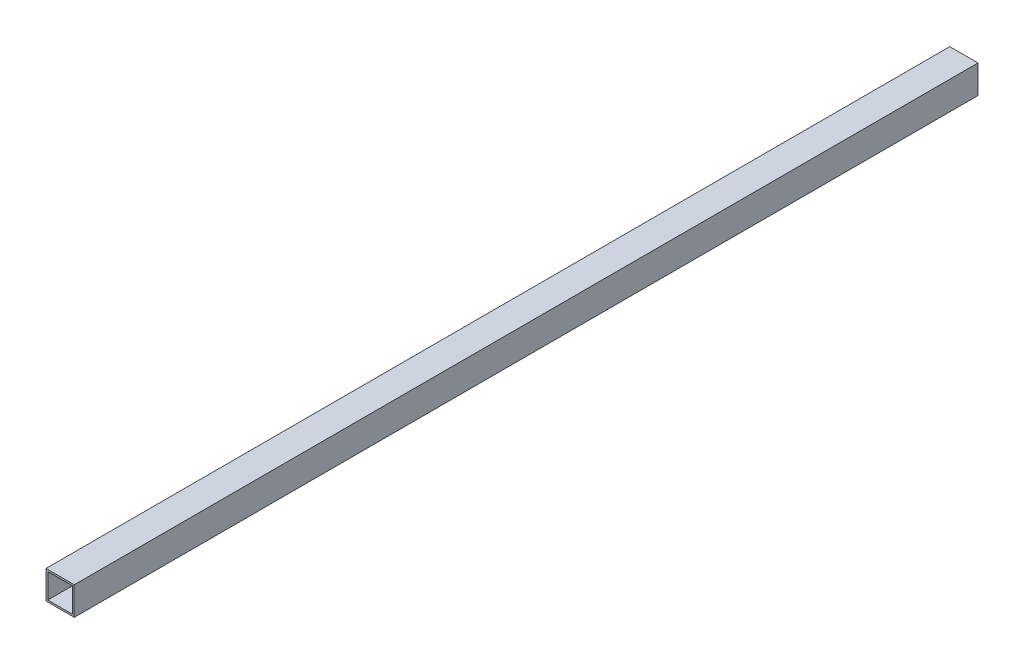
ISO-10303-21;
HEADER;
FILE_DESCRIPTION(('STEP AP214'),'2;1');
FILE_NAME('part.step','',(''),(''),'','','');
FILE_SCHEMA(('AUTOMOTIVE_DESIGN { 1 0 10303 214 1 1 1 1 }'));
ENDSEC;
DATA;
#1=APPLICATION_CONTEXT('core data for automotive mechanical design processes');
#2=APPLICATION_PROTOCOL_DEFINITION('international standard','automotive_design',2000,#1);
#3=PRODUCT_CONTEXT('',#1,'mechanical');
#4=PRODUCT('Part','Part','',(#3));
#5=PRODUCT_RELATED_PRODUCT_CATEGORY('part','',(#4));
#6=PRODUCT_DEFINITION_FORMATION('','',#4);
#7=PRODUCT_DEFINITION_CONTEXT('part definition',#1,'design');
#8=PRODUCT_DEFINITION('design','',#6,#7);
#9=PRODUCT_DEFINITION_SHAPE('','',#8);
#10=(LENGTH_UNIT() NAMED_UNIT(*) SI_UNIT(.MILLI.,.METRE.));
#11=(NAMED_UNIT(*) PLANE_ANGLE_UNIT() SI_UNIT($,.RADIAN.));
#12=(NAMED_UNIT(*) SI_UNIT($,.STERADIAN.) SOLID_ANGLE_UNIT());
#13=UNCERTAINTY_MEASURE_WITH_UNIT(LENGTH_MEASURE(1.E-05),#10,'distance_accuracy_value','');
#14=(GEOMETRIC_REPRESENTATION_CONTEXT(3) GLOBAL_UNCERTAINTY_ASSIGNED_CONTEXT((#13)) GLOBAL_UNIT_ASSIGNED_CONTEXT((#10,
#11,#12)) REPRESENTATION_CONTEXT('',''));
#15=CARTESIAN_POINT('',(0.,0.,0.));
#16=DIRECTION('',(0.,0.,1.));
#17=DIRECTION('',(1.,0.,0.));
#18=AXIS2_PLACEMENT_3D('',#15,#16,#17);
#19=CARTESIAN_POINT('',(0.,0.,1625.6));
#20=DIRECTION('',(0.,0.,-1.));
#21=DIRECTION('',(-1.,0.,0.));
#22=AXIS2_PLACEMENT_3D('',#19,#20,#21);
#23=PLANE('',#22);
#24=DIRECTION('',(0.,1.,0.));
#25=VECTOR('',#24,1.);
#26=CARTESIAN_POINT('',(25.4,-25.4,1625.6));
#27=LINE('',#26,#25);
#28=CARTESIAN_POINT('',(25.4,-25.4,1625.6));
#29=VERTEX_POINT('',#28);
#30=CARTESIAN_POINT('',(25.4,25.4,1625.6));
#31=VERTEX_POINT('',#30);
#32=EDGE_CURVE('E134',#29,#31,#27,.T.);
#33=ORIENTED_EDGE('',*,*,#32,.T.);
#34=DIRECTION('',(-1.,0.,0.));
#35=VECTOR('',#34,1.);
#36=CARTESIAN_POINT('',(-25.4,25.4,1625.6));
#37=LINE('',#36,#35);
#38=CARTESIAN_POINT('',(-25.4,25.4,1625.6));
#39=VERTEX_POINT('',#38);
#40=EDGE_CURVE('E137',#31,#39,#37,.T.);
#41=ORIENTED_EDGE('',*,*,#40,.T.);
#42=DIRECTION('',(0.,-1.,0.));
#43=VECTOR('',#42,1.);
#44=CARTESIAN_POINT('',(-25.4,-25.4,1625.6));
#45=LINE('',#44,#43);
#46=CARTESIAN_POINT('',(-25.4,-25.4,1625.6));
#47=VERTEX_POINT('',#46);
#48=EDGE_CURVE('E140',#39,#47,#45,.T.);
#49=ORIENTED_EDGE('',*,*,#48,.T.);
#50=DIRECTION('',(1.,0.,0.));
#51=VECTOR('',#50,1.);
#52=CARTESIAN_POINT('',(-25.4,-25.4,1625.6));
#53=LINE('',#52,#51);
#54=EDGE_CURVE('E142',#47,#29,#53,.T.);
#55=ORIENTED_EDGE('',*,*,#54,.T.);
#56=EDGE_LOOP('',(#33,#41,#49,#55));
#57=FACE_BOUND('',#56,.T.);
#58=DIRECTION('',(0.,1.,0.));
#59=VECTOR('',#58,1.);
#60=CARTESIAN_POINT('',(22.225,-22.225,1625.6));
#61=LINE('',#60,#59);
#62=CARTESIAN_POINT('',(22.225,-22.225,1625.6));
#63=VERTEX_POINT('',#62);
#64=CARTESIAN_POINT('',(22.225,22.225,1625.6));
#65=VERTEX_POINT('',#64);
#66=EDGE_CURVE('E98',#63,#65,#61,.T.);
#67=ORIENTED_EDGE('',*,*,#66,.F.);
#68=DIRECTION('',(1.,0.,0.));
#69=VECTOR('',#68,1.);
#70=CARTESIAN_POINT('',(-22.225,-22.225,1625.6));
#71=LINE('',#70,#69);
#72=CARTESIAN_POINT('',(-22.225,-22.225,1625.6));
#73=VERTEX_POINT('',#72);
#74=EDGE_CURVE('E120',#73,#63,#71,.T.);
#75=ORIENTED_EDGE('',*,*,#74,.F.);
#76=DIRECTION('',(0.,-1.,0.));
#77=VECTOR('',#76,1.);
#78=CARTESIAN_POINT('',(-22.225,-22.225,1625.6));
#79=LINE('',#78,#77);
#80=CARTESIAN_POINT('',(-22.225,22.225,1625.6));
#81=VERTEX_POINT('',#80);
#82=EDGE_CURVE('E118',#81,#73,#79,.T.);
#83=ORIENTED_EDGE('',*,*,#82,.F.);
#84=DIRECTION('',(-1.,0.,0.));
#85=VECTOR('',#84,1.);
#86=CARTESIAN_POINT('',(-22.225,22.225,1625.6));
#87=LINE('',#86,#85);
#88=EDGE_CURVE('E106',#65,#81,#87,.T.);
#89=ORIENTED_EDGE('',*,*,#88,.F.);
#90=EDGE_LOOP('',(#67,#75,#83,#89));
#91=FACE_BOUND('',#90,.T.);
#92=ADVANCED_FACE('F33',(#57,#91),#23,.F.);
#93=CARTESIAN_POINT('',(0.,0.,0.));
#94=DIRECTION('',(0.,0.,-1.));
#95=DIRECTION('',(-1.,0.,0.));
#96=AXIS2_PLACEMENT_3D('',#93,#94,#95);
#97=PLANE('',#96);
#98=DIRECTION('',(0.,1.,0.));
#99=VECTOR('',#98,1.);
#100=CARTESIAN_POINT('',(25.4,-25.4,0.));
#101=LINE('',#100,#99);
#102=CARTESIAN_POINT('',(25.4,-25.4,0.));
#103=VERTEX_POINT('',#102);
#104=CARTESIAN_POINT('',(25.4,25.4,0.));
#105=VERTEX_POINT('',#104);
#106=EDGE_CURVE('E114',#103,#105,#101,.T.);
#107=ORIENTED_EDGE('',*,*,#106,.F.);
#108=DIRECTION('',(1.,0.,0.));
#109=VECTOR('',#108,1.);
#110=CARTESIAN_POINT('',(-25.4,-25.4,0.));
#111=LINE('',#110,#109);
#112=CARTESIAN_POINT('',(-25.4,-25.4,0.));
#113=VERTEX_POINT('',#112);
#114=EDGE_CURVE('E138',#113,#103,#111,.T.);
#115=ORIENTED_EDGE('',*,*,#114,.F.);
#116=DIRECTION('',(0.,-1.,0.));
#117=VECTOR('',#116,1.);
#118=CARTESIAN_POINT('',(-25.4,-25.4,0.));
#119=LINE('',#118,#117);
#120=CARTESIAN_POINT('',(-25.4,25.4,0.));
#121=VERTEX_POINT('',#120);
#122=EDGE_CURVE('E149',#121,#113,#119,.T.);
#123=ORIENTED_EDGE('',*,*,#122,.F.);
#124=DIRECTION('',(-1.,0.,0.));
#125=VECTOR('',#124,1.);
#126=CARTESIAN_POINT('',(-25.4,25.4,0.));
#127=LINE('',#126,#125);
#128=EDGE_CURVE('E147',#105,#121,#127,.T.);
#129=ORIENTED_EDGE('',*,*,#128,.F.);
#130=EDGE_LOOP('',(#107,#115,#123,#129));
#131=FACE_BOUND('',#130,.T.);
#132=DIRECTION('',(1.,0.,0.));
#133=VECTOR('',#132,1.);
#134=CARTESIAN_POINT('',(-22.225,-22.225,0.));
#135=LINE('',#134,#133);
#136=CARTESIAN_POINT('',(-22.225,-22.225,0.));
#137=VERTEX_POINT('',#136);
#138=CARTESIAN_POINT('',(22.225,-22.225,0.));
#139=VERTEX_POINT('',#138);
#140=EDGE_CURVE('E107',#137,#139,#135,.T.);
#141=ORIENTED_EDGE('',*,*,#140,.T.);
#142=DIRECTION('',(0.,1.,0.));
#143=VECTOR('',#142,1.);
#144=CARTESIAN_POINT('',(22.225,-22.225,0.));
#145=LINE('',#144,#143);
#146=CARTESIAN_POINT('',(22.225,22.225,0.));
#147=VERTEX_POINT('',#146);
#148=EDGE_CURVE('E56',#139,#147,#145,.T.);
#149=ORIENTED_EDGE('',*,*,#148,.T.);
#150=DIRECTION('',(-1.,0.,0.));
#151=VECTOR('',#150,1.);
#152=CARTESIAN_POINT('',(-22.225,22.225,0.));
#153=LINE('',#152,#151);
#154=CARTESIAN_POINT('',(-22.225,22.225,0.));
#155=VERTEX_POINT('',#154);
#156=EDGE_CURVE('E113',#147,#155,#153,.T.);
#157=ORIENTED_EDGE('',*,*,#156,.T.);
#158=DIRECTION('',(0.,-1.,0.));
#159=VECTOR('',#158,1.);
#160=CARTESIAN_POINT('',(-22.225,-22.225,0.));
#161=LINE('',#160,#159);
#162=EDGE_CURVE('E126',#155,#137,#161,.T.);
#163=ORIENTED_EDGE('',*,*,#162,.T.);
#164=EDGE_LOOP('',(#141,#149,#157,#163));
#165=FACE_BOUND('',#164,.T.);
#166=ADVANCED_FACE('F167',(#131,#165),#97,.T.);
#167=CARTESIAN_POINT('',(25.4,-25.4,1625.6));
#168=DIRECTION('',(-1.,0.,0.));
#169=DIRECTION('',(0.,0.,1.));
#170=AXIS2_PLACEMENT_3D('',#167,#168,#169);
#171=PLANE('',#170);
#172=ORIENTED_EDGE('',*,*,#106,.T.);
#173=DIRECTION('',(0.,0.,-1.));
#174=VECTOR('',#173,1.);
#175=CARTESIAN_POINT('',(25.4,25.4,1625.6));
#176=LINE('',#175,#174);
#177=EDGE_CURVE('E11',#31,#105,#176,.T.);
#178=ORIENTED_EDGE('',*,*,#177,.F.);
#179=ORIENTED_EDGE('',*,*,#32,.F.);
#180=DIRECTION('',(0.,0.,-1.));
#181=VECTOR('',#180,1.);
#182=CARTESIAN_POINT('',(25.4,-25.4,1625.6));
#183=LINE('',#182,#181);
#184=EDGE_CURVE('E144',#29,#103,#183,.T.);
#185=ORIENTED_EDGE('',*,*,#184,.T.);
#186=EDGE_LOOP('',(#172,#178,#179,#185));
#187=FACE_BOUND('',#186,.T.);
#188=ADVANCED_FACE('F35',(#187),#171,.F.);
#189=CARTESIAN_POINT('',(-25.4,25.4,1625.6));
#190=DIRECTION('',(0.,-1.,0.));
#191=DIRECTION('',(0.,0.,-1.));
#192=AXIS2_PLACEMENT_3D('',#189,#190,#191);
#193=PLANE('',#192);
#194=ORIENTED_EDGE('',*,*,#128,.T.);
#195=DIRECTION('',(0.,0.,-1.));
#196=VECTOR('',#195,1.);
#197=CARTESIAN_POINT('',(-25.4,25.4,1625.6));
#198=LINE('',#197,#196);
#199=EDGE_CURVE('E41',#39,#121,#198,.T.);
#200=ORIENTED_EDGE('',*,*,#199,.F.);
#201=ORIENTED_EDGE('',*,*,#40,.F.);
#202=ORIENTED_EDGE('',*,*,#177,.T.);
#203=EDGE_LOOP('',(#194,#200,#201,#202));
#204=FACE_BOUND('',#203,.T.);
#205=ADVANCED_FACE('F177',(#204),#193,.F.);
#206=CARTESIAN_POINT('',(-25.4,-25.4,1625.6));
#207=DIRECTION('',(1.,0.,0.));
#208=DIRECTION('',(0.,0.,-1.));
#209=AXIS2_PLACEMENT_3D('',#206,#207,#208);
#210=PLANE('',#209);
#211=ORIENTED_EDGE('',*,*,#122,.T.);
#212=DIRECTION('',(0.,0.,-1.));
#213=VECTOR('',#212,1.);
#214=CARTESIAN_POINT('',(-25.4,-25.4,1625.6));
#215=LINE('',#214,#213);
#216=EDGE_CURVE('E154',#47,#113,#215,.T.);
#217=ORIENTED_EDGE('',*,*,#216,.F.);
#218=ORIENTED_EDGE('',*,*,#48,.F.);
#219=ORIENTED_EDGE('',*,*,#199,.T.);
#220=EDGE_LOOP('',(#211,#217,#218,#219));
#221=FACE_BOUND('',#220,.T.);
#222=ADVANCED_FACE('F161',(#221),#210,.F.);
#223=CARTESIAN_POINT('',(-25.4,-25.4,1625.6));
#224=DIRECTION('',(0.,1.,0.));
#225=DIRECTION('',(0.,0.,1.));
#226=AXIS2_PLACEMENT_3D('',#223,#224,#225);
#227=PLANE('',#226);
#228=ORIENTED_EDGE('',*,*,#114,.T.);
#229=ORIENTED_EDGE('',*,*,#184,.F.);
#230=ORIENTED_EDGE('',*,*,#54,.F.);
#231=ORIENTED_EDGE('',*,*,#216,.T.);
#232=EDGE_LOOP('',(#228,#229,#230,#231));
#233=FACE_BOUND('',#232,.T.);
#234=ADVANCED_FACE('F171',(#233),#227,.F.);
#235=CARTESIAN_POINT('',(22.225,-22.225,1625.6));
#236=DIRECTION('',(-1.,0.,0.));
#237=DIRECTION('',(0.,0.,1.));
#238=AXIS2_PLACEMENT_3D('',#235,#236,#237);
#239=PLANE('',#238);
#240=ORIENTED_EDGE('',*,*,#148,.F.);
#241=DIRECTION('',(0.,0.,-1.));
#242=VECTOR('',#241,1.);
#243=CARTESIAN_POINT('',(22.225,-22.225,1625.6));
#244=LINE('',#243,#242);
#245=EDGE_CURVE('E102',#63,#139,#244,.T.);
#246=ORIENTED_EDGE('',*,*,#245,.F.);
#247=ORIENTED_EDGE('',*,*,#66,.T.);
#248=DIRECTION('',(0.,0.,-1.));
#249=VECTOR('',#248,1.);
#250=CARTESIAN_POINT('',(22.225,22.225,1625.6));
#251=LINE('',#250,#249);
#252=EDGE_CURVE('E101',#65,#147,#251,.T.);
#253=ORIENTED_EDGE('',*,*,#252,.T.);
#254=EDGE_LOOP('',(#240,#246,#247,#253));
#255=FACE_BOUND('',#254,.T.);
#256=ADVANCED_FACE('F100',(#255),#239,.T.);
#257=CARTESIAN_POINT('',(-22.225,22.225,1625.6));
#258=DIRECTION('',(0.,-1.,0.));
#259=DIRECTION('',(0.,0.,-1.));
#260=AXIS2_PLACEMENT_3D('',#257,#258,#259);
#261=PLANE('',#260);
#262=ORIENTED_EDGE('',*,*,#156,.F.);
#263=ORIENTED_EDGE('',*,*,#252,.F.);
#264=ORIENTED_EDGE('',*,*,#88,.T.);
#265=DIRECTION('',(0.,0.,-1.));
#266=VECTOR('',#265,1.);
#267=CARTESIAN_POINT('',(-22.225,22.225,1625.6));
#268=LINE('',#267,#266);
#269=EDGE_CURVE('E115',#81,#155,#268,.T.);
#270=ORIENTED_EDGE('',*,*,#269,.T.);
#271=EDGE_LOOP('',(#262,#263,#264,#270));
#272=FACE_BOUND('',#271,.T.);
#273=ADVANCED_FACE('F110',(#272),#261,.T.);
#274=CARTESIAN_POINT('',(-22.225,-22.225,1625.6));
#275=DIRECTION('',(1.,0.,0.));
#276=DIRECTION('',(0.,0.,-1.));
#277=AXIS2_PLACEMENT_3D('',#274,#275,#276);
#278=PLANE('',#277);
#279=ORIENTED_EDGE('',*,*,#162,.F.);
#280=ORIENTED_EDGE('',*,*,#269,.F.);
#281=ORIENTED_EDGE('',*,*,#82,.T.);
#282=DIRECTION('',(0.,0.,-1.));
#283=VECTOR('',#282,1.);
#284=CARTESIAN_POINT('',(-22.225,-22.225,1625.6));
#285=LINE('',#284,#283);
#286=EDGE_CURVE('E48',#73,#137,#285,.T.);
#287=ORIENTED_EDGE('',*,*,#286,.T.);
#288=EDGE_LOOP('',(#279,#280,#281,#287));
#289=FACE_BOUND('',#288,.T.);
#290=ADVANCED_FACE('F200',(#289),#278,.T.);
#291=CARTESIAN_POINT('',(-22.225,-22.225,1625.6));
#292=DIRECTION('',(0.,1.,0.));
#293=DIRECTION('',(0.,0.,1.));
#294=AXIS2_PLACEMENT_3D('',#291,#292,#293);
#295=PLANE('',#294);
#296=ORIENTED_EDGE('',*,*,#140,.F.);
#297=ORIENTED_EDGE('',*,*,#286,.F.);
#298=ORIENTED_EDGE('',*,*,#74,.T.);
#299=ORIENTED_EDGE('',*,*,#245,.T.);
#300=EDGE_LOOP('',(#296,#297,#298,#299));
#301=FACE_BOUND('',#300,.T.);
#302=ADVANCED_FACE('F204',(#301),#295,.T.);
#303=CLOSED_SHELL('',(#92,#166,#188,#205,#222,#234,#256,#273,#290,#302));
#304=MANIFOLD_SOLID_BREP('B2',#303);
#305=ADVANCED_BREP_SHAPE_REPRESENTATION('',(#18,#304),#14);
#306=SHAPE_DEFINITION_REPRESENTATION(#9,#305);
ENDSEC;
END-ISO-10303-21;
